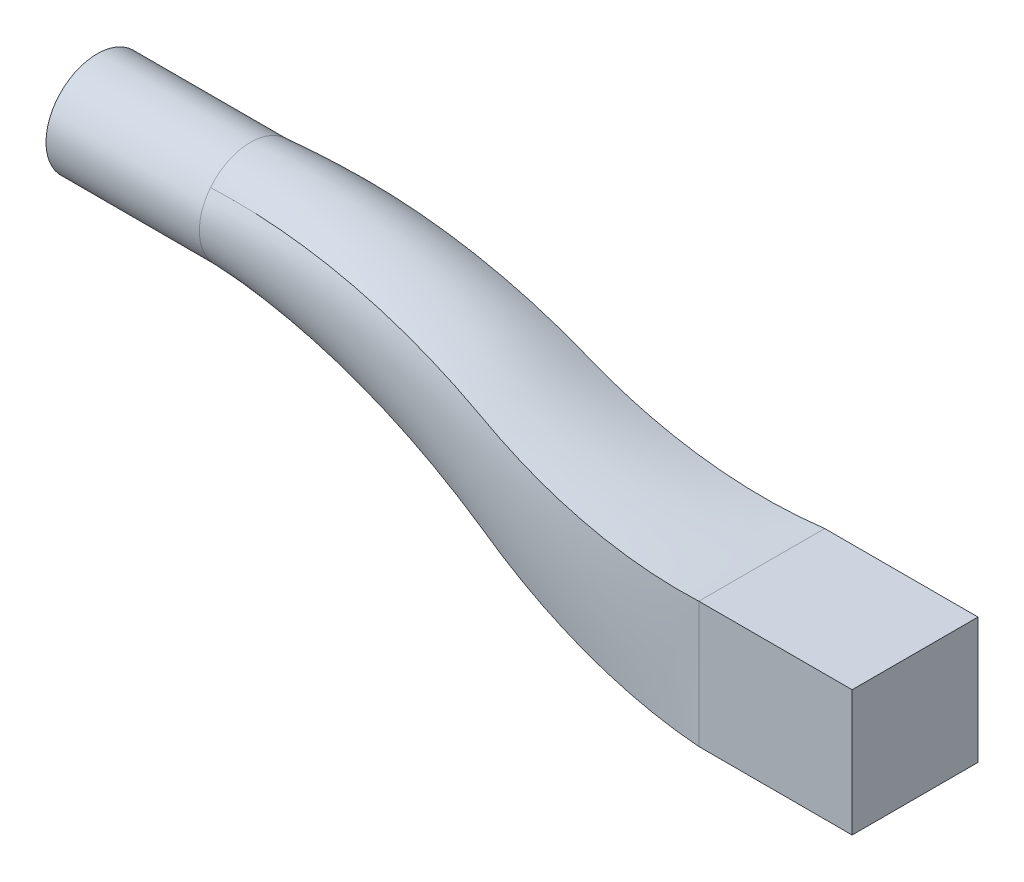
ISO-10303-21;
HEADER;
FILE_DESCRIPTION(('STEP AP214'),'2;1');
FILE_NAME('part.step','',(''),(''),'','','');
FILE_SCHEMA(('AUTOMOTIVE_DESIGN { 1 0 10303 214 1 1 1 1 }'));
ENDSEC;
DATA;
#1=APPLICATION_CONTEXT('core data for automotive mechanical design processes');
#2=APPLICATION_PROTOCOL_DEFINITION('international standard','automotive_design',2000,#1);
#3=PRODUCT_CONTEXT('',#1,'mechanical');
#4=PRODUCT('Part','Part','',(#3));
#5=PRODUCT_RELATED_PRODUCT_CATEGORY('part','',(#4));
#6=PRODUCT_DEFINITION_FORMATION('','',#4);
#7=PRODUCT_DEFINITION_CONTEXT('part definition',#1,'design');
#8=PRODUCT_DEFINITION('design','',#6,#7);
#9=PRODUCT_DEFINITION_SHAPE('','',#8);
#10=(LENGTH_UNIT() NAMED_UNIT(*) SI_UNIT(.MILLI.,.METRE.));
#11=(NAMED_UNIT(*) PLANE_ANGLE_UNIT() SI_UNIT($,.RADIAN.));
#12=(NAMED_UNIT(*) SI_UNIT($,.STERADIAN.) SOLID_ANGLE_UNIT());
#13=UNCERTAINTY_MEASURE_WITH_UNIT(LENGTH_MEASURE(1.E-05),#10,'distance_accuracy_value','');
#14=(GEOMETRIC_REPRESENTATION_CONTEXT(3) GLOBAL_UNCERTAINTY_ASSIGNED_CONTEXT((#13)) GLOBAL_UNIT_ASSIGNED_CONTEXT((#10,
#11,#12)) REPRESENTATION_CONTEXT('',''));
#15=CARTESIAN_POINT('',(0.,0.,0.));
#16=DIRECTION('',(0.,0.,1.));
#17=DIRECTION('',(1.,0.,0.));
#18=AXIS2_PLACEMENT_3D('',#15,#16,#17);
#19=CARTESIAN_POINT('',(1021.37315576226,-118.243305111773,125.73));
#20=CARTESIAN_POINT('',(864.402326566791,-131.656754821237,118.929127854998));
#21=CARTESIAN_POINT('',(708.143629326013,-103.611491656139,112.128255709995));
#22=CARTESIAN_POINT('',(392.936444227267,45.4312189083684,96.7959065081983));
#23=CARTESIAN_POINT('',(196.914895518404,80.6131064873941,88.2644294514036));
#24=CARTESIAN_POINT('',(0.,63.7863619156872,79.7329523946089));
#25=CARTESIAN_POINT('',(1021.37315576226,-118.243305111772,114.726095999935));
#26=CARTESIAN_POINT('',(864.402326566791,-130.815229397028,108.878980639018));
#27=CARTESIAN_POINT('',(708.143629326013,-101.92844080772,103.0318652781));
#28=CARTESIAN_POINT('',(392.936444227267,49.0114619684742,89.8497303069753));
#29=CARTESIAN_POINT('',(196.914895518404,85.2490163349766,82.5147106967684));
#30=CARTESIAN_POINT('',(0.,69.4779385507464,75.1796910865616));
#31=CARTESIAN_POINT('',(1021.37315576226,-118.243305111773,93.2899023629017));
#32=CARTESIAN_POINT('',(864.402326566792,-129.240817430892,89.0552056625087));
#33=CARTESIAN_POINT('',(708.143629326014,-98.7796168754477,84.8205089621158));
#34=CARTESIAN_POINT('',(392.936444227267,55.7097474312092,75.2735204009744));
#35=CARTESIAN_POINT('',(196.914895518404,93.9223513620388,69.961228540226));
#36=CARTESIAN_POINT('',(0.,80.1263231421358,64.6489366794775));
#37=CARTESIAN_POINT('',(1021.37315576226,-118.243305111773,67.2687703282233));
#38=CARTESIAN_POINT('',(864.402326566791,-127.707608205616,64.4779491553693));
#39=CARTESIAN_POINT('',(708.143629326013,-95.7131984248958,61.6871279825154));
#40=CARTESIAN_POINT('',(392.936444227267,62.2327371479365,55.3953107170768));
#41=CARTESIAN_POINT('',(196.914895518404,102.368703119665,51.8943146244922));
#42=CARTESIAN_POINT('',(0.,90.4960369406618,48.3933185319076));
#43=CARTESIAN_POINT('',(1021.37315576226,-118.243305111773,46.624739973406));
#44=CARTESIAN_POINT('',(864.402326566791,-126.823050917887,44.7727425352965));
#45=CARTESIAN_POINT('',(708.143629326013,-93.9440838494382,42.920745097187));
#46=CARTESIAN_POINT('',(392.936444227267,65.996057898027,38.7454759792704));
#47=CARTESIAN_POINT('',(196.914895518404,107.24167275666,36.4222042994632));
#48=CARTESIAN_POINT('',(0.,96.4786554645605,34.098932619656));
#49=CARTESIAN_POINT('',(1021.37315576226,-118.243305111773,31.1622427577089));
#50=CARTESIAN_POINT('',(864.402326566792,-126.342509099629,29.9439661274253));
#51=CARTESIAN_POINT('',(708.143629326013,-92.9830002129212,28.7256894971417));
#52=CARTESIAN_POINT('',(392.936444227267,68.0405077273666,25.9791237153363));
#53=CARTESIAN_POINT('',(196.914895518404,109.888946960564,24.4508345638145));
#54=CARTESIAN_POINT('',(0.,99.7287540430287,22.9225454122928));
#55=CARTESIAN_POINT('',(1021.37315576226,-118.243305111773,15.6543590063811));
#56=CARTESIAN_POINT('',(864.402326566792,-126.054057236597,15.0372779478459));
#57=CARTESIAN_POINT('',(708.143629326013,-92.406096486858,14.4201968893107));
#58=CARTESIAN_POINT('',(392.936444227267,69.2677169727241,13.0290073369195));
#59=CARTESIAN_POINT('',(196.914895518404,111.478009862184,12.2548988430634));
#60=CARTESIAN_POINT('',(0.,101.679670600911,11.4807903492074));
#61=CARTESIAN_POINT('',(1021.37315576226,-118.243305111773,5.23875000000003));
#62=CARTESIAN_POINT('',(864.402326566791,-125.99072679191,5.02783810616596));
#63=CARTESIAN_POINT('',(708.143629326013,-92.2794355974837,4.81692621233189));
#64=CARTESIAN_POINT('',(392.936444227267,69.5371543284614,4.34143207891363));
#65=CARTESIAN_POINT('',(196.914895518404,111.826893239597,4.07684983932944));
#66=CARTESIAN_POINT('',(0.,102.108,3.81226759974524));
#67=CARTESIAN_POINT('',(1021.37315576226,-118.243305111773,-5.23875));
#68=CARTESIAN_POINT('',(864.402326566791,-125.99072679191,-5.02783810616594));
#69=CARTESIAN_POINT('',(708.143629326013,-92.2794355974837,-4.81692621233187));
#70=CARTESIAN_POINT('',(392.936444227267,69.5371543284613,-4.34143207891361));
#71=CARTESIAN_POINT('',(196.914895518404,111.826893239597,-4.07684983932942));
#72=CARTESIAN_POINT('',(0.,102.108,-3.81226759974524));
#73=CARTESIAN_POINT('',(1021.37315576226,-118.243305111772,-15.654359006381));
#74=CARTESIAN_POINT('',(864.402326566791,-126.054057236597,-15.0372779478459));
#75=CARTESIAN_POINT('',(708.143629326013,-92.4060964868579,-14.4201968893107));
#76=CARTESIAN_POINT('',(392.936444227267,69.2677169727242,-13.0290073369195));
#77=CARTESIAN_POINT('',(196.914895518404,111.478009862184,-12.2548988430634));
#78=CARTESIAN_POINT('',(0.,101.679670600912,-11.4807903492074));
#79=CARTESIAN_POINT('',(1021.37315576226,-118.243305111772,-31.1622427577088));
#80=CARTESIAN_POINT('',(864.402326566791,-126.342509099629,-29.9439661274252));
#81=CARTESIAN_POINT('',(708.143629326013,-92.9830002129212,-28.7256894971417));
#82=CARTESIAN_POINT('',(392.936444227267,68.0405077273665,-25.9791237153363));
#83=CARTESIAN_POINT('',(196.914895518404,109.888946960564,-24.4508345638146));
#84=CARTESIAN_POINT('',(0.,99.7287540430284,-22.9225454122928));
#85=CARTESIAN_POINT('',(1021.37315576226,-118.243305111773,-46.6247399734058));
#86=CARTESIAN_POINT('',(864.402326566791,-126.823050917887,-44.7727425352964));
#87=CARTESIAN_POINT('',(708.143629326013,-93.9440838494381,-42.9207450971869));
#88=CARTESIAN_POINT('',(392.936444227267,65.9960578980272,-38.7454759792703));
#89=CARTESIAN_POINT('',(196.914895518404,107.24167275666,-36.4222042994631));
#90=CARTESIAN_POINT('',(0.,96.4786554645609,-34.098932619656));
#91=CARTESIAN_POINT('',(1021.37315576226,-118.243305111773,-67.2687703282232));
#92=CARTESIAN_POINT('',(864.402326566792,-127.707608205616,-64.4779491553692));
#93=CARTESIAN_POINT('',(708.143629326014,-95.713198424896,-61.6871279825153));
#94=CARTESIAN_POINT('',(392.936444227267,62.2327371479361,-55.3953107170768));
#95=CARTESIAN_POINT('',(196.914895518404,102.368703119665,-51.8943146244922));
#96=CARTESIAN_POINT('',(0.,90.4960369406614,-48.3933185319077));
#97=CARTESIAN_POINT('',(1021.37315576226,-118.243305111772,-93.2899023629017));
#98=CARTESIAN_POINT('',(864.402326566791,-129.240817430892,-89.0552056625088));
#99=CARTESIAN_POINT('',(708.143629326013,-98.7796168754475,-84.8205089621158));
#100=CARTESIAN_POINT('',(392.936444227267,55.7097474312094,-75.2735204009744));
#101=CARTESIAN_POINT('',(196.914895518404,93.9223513620389,-69.961228540226));
#102=CARTESIAN_POINT('',(0.,80.1263231421359,-64.6489366794775));
#103=CARTESIAN_POINT('',(1021.37315576226,-118.243305111773,-114.726095999935));
#104=CARTESIAN_POINT('',(864.402326566791,-130.815229397028,-108.878980639018));
#105=CARTESIAN_POINT('',(708.143629326013,-101.92844080772,-103.0318652781));
#106=CARTESIAN_POINT('',(392.936444227267,49.0114619684742,-89.8497303069752));
#107=CARTESIAN_POINT('',(196.914895518404,85.2490163349766,-82.5147106967684));
#108=CARTESIAN_POINT('',(0.,69.4779385507464,-75.1796910865616));
#109=CARTESIAN_POINT('',(1021.37315576226,-118.243305111773,-125.73));
#110=CARTESIAN_POINT('',(864.402326566791,-131.656754821238,-118.929127854998));
#111=CARTESIAN_POINT('',(708.143629326013,-103.611491656139,-112.128255709995));
#112=CARTESIAN_POINT('',(392.936444227267,45.4312189083684,-96.7959065081983));
#113=CARTESIAN_POINT('',(196.914895518404,80.613106487394,-88.2644294514036));
#114=CARTESIAN_POINT('',(0.,63.7863619156871,-79.7329523946089));
#115=B_SPLINE_SURFACE_WITH_KNOTS('',3,3,((#19,#20,#21,#22,#23,#24),(#25,#26,#27,#28,#29,#30),
(#31,#32,#33,#34,#35,#36),(#37,#38,#39,#40,#41,#42),(#43,#44,#45,#46,#47,#48),(#49,#50,#51,#52,
#53,#54),(#55,#56,#57,#58,#59,#60),(#61,#62,#63,#64,#65,#66),(#67,#68,#69,#70,#71,#72),(#73,#74,
#75,#76,#77,#78),(#79,#80,#81,#82,#83,#84),(#85,#86,#87,#88,#89,#90),(#91,#92,#93,#94,#95,#96),
(#97,#98,#99,#100,#101,#102),(#103,#104,#105,#106,#107,#108),(#109,#110,#111,#112,#113,#114)),
.UNSPECIFIED.,.F.,.F.,.F.,(4,1,1,1,1,1,2,1,1,1,1,1,4),(4,2,4),(0.732388356261361,
0.765839811728691,0.799291267196021,0.816016994929686,0.832742722663351,0.849468450397016,
0.866194178130681,0.882919905864346,0.899645633598011,0.916371361331675,0.93309708906534,
0.96654854453267,1.),(0.,0.443563608909016,1.),.UNSPECIFIED.);
#116=DIRECTION('',(0.,0.,-1.));
#117=VECTOR('',#116,1.);
#118=CARTESIAN_POINT('',(1021.37315576226,-118.243305111773,-125.73));
#119=LINE('',#118,#117);
#120=CARTESIAN_POINT('',(1021.37315576226,-118.243305111773,125.73));
#121=VERTEX_POINT('',#120);
#122=CARTESIAN_POINT('',(1021.37315576226,-118.243305111773,-125.73));
#123=VERTEX_POINT('',#122);
#124=EDGE_CURVE('E184',#121,#123,#119,.T.);
#125=CARTESIAN_POINT('',(1021.37315576226,-118.243305111773,-125.73));
#126=CARTESIAN_POINT('',(864.402326566791,-131.656754821238,-118.929127854998));
#127=CARTESIAN_POINT('',(708.143629326013,-103.611491656139,-112.128255709995));
#128=CARTESIAN_POINT('',(392.936444227267,45.4312189083684,-96.7959065081983));
#129=CARTESIAN_POINT('',(196.914895518404,80.613106487394,-88.2644294514036));
#130=CARTESIAN_POINT('',(0.,63.7863619156871,-79.7329523946089));
#131=B_SPLINE_CURVE_WITH_KNOTS('',3,(#125,#126,#127,#128,#129,#130),.UNSPECIFIED.,.F.,.F.,(4,2,
4),(0.,0.443563608909016,1.),.UNSPECIFIED.);
#132=CARTESIAN_POINT('',(0.,63.7867229035302,-79.7334037330846));
#133=VERTEX_POINT('',#132);
#134=EDGE_CURVE('E349',#123,#133,#131,.T.);
#135=CARTESIAN_POINT('',(0.,0.,0.));
#136=DIRECTION('',(-1.,0.,0.));
#137=DIRECTION('',(0.,0.,1.));
#138=AXIS2_PLACEMENT_3D('',#135,#136,#137);
#139=CIRCLE('',#138,102.108);
#140=CARTESIAN_POINT('',(0.,63.7867199932636,79.733400107363));
#141=VERTEX_POINT('',#140);
#142=EDGE_CURVE('E13',#141,#133,#139,.T.);
#143=CARTESIAN_POINT('',(1021.37315576226,-118.243305111773,125.73));
#144=CARTESIAN_POINT('',(864.402326566791,-131.656754821237,118.929127854998));
#145=CARTESIAN_POINT('',(708.143629326013,-103.611491656139,112.128255709995));
#146=CARTESIAN_POINT('',(392.936444227267,45.4312189083684,96.7959065081983));
#147=CARTESIAN_POINT('',(196.914895518404,80.6131064873941,88.2644294514036));
#148=CARTESIAN_POINT('',(0.,63.7863619156872,79.7329523946089));
#149=B_SPLINE_CURVE_WITH_KNOTS('',3,(#143,#144,#145,#146,#147,#148),.UNSPECIFIED.,.F.,.F.,(4,2,
4),(0.,0.443563608909016,1.),.UNSPECIFIED.);
#150=EDGE_CURVE('E351',#121,#141,#149,.T.);
#151=ORIENTED_EDGE('',*,*,#124,.T.);
#152=ORIENTED_EDGE('',*,*,#134,.T.);
#153=ORIENTED_EDGE('',*,*,#142,.F.);
#154=ORIENTED_EDGE('',*,*,#150,.F.);
#155=EDGE_LOOP('',(#151,#152,#153,#154));
#156=FACE_BOUND('',#155,.T.);
#157=ADVANCED_FACE('F115',(#156),#115,.T.);
#158=CARTESIAN_POINT('',(1021.37315576226,-369.703305111773,125.73));
#159=CARTESIAN_POINT('',(864.402326566791,-366.966293375542,116.805196891922));
#160=CARTESIAN_POINT('',(708.143629326013,-322.770568764749,107.880393783845));
#161=CARTESIAN_POINT('',(392.936444227267,-137.31715831118,87.7597100108249));
#162=CARTESIAN_POINT('',(196.914895518404,-81.8750322887881,76.5638293458828));
#163=CARTESIAN_POINT('',(0.,-78.4415384171288,65.3679486809407));
#164=CARTESIAN_POINT('',(1021.37315576226,-359.225805111773,125.73));
#165=CARTESIAN_POINT('',(864.402326566791,-357.413422982725,117.554616448241));
#166=CARTESIAN_POINT('',(708.143629326013,-314.142327979113,109.379232896483));
#167=CARTESIAN_POINT('',(392.936444227267,-130.773465465481,90.9480915955385));
#168=CARTESIAN_POINT('',(196.914895518404,-76.4912577758443,80.6923338463531));
#169=CARTESIAN_POINT('',(0.,-74.2176822369396,70.4365760971678));
#170=CARTESIAN_POINT('',(1021.37315576226,-338.270805111773,125.73));
#171=CARTESIAN_POINT('',(864.402326566791,-338.162007255129,118.932030979872));
#172=CARTESIAN_POINT('',(708.143629326013,-296.594496523922,112.134061959743));
#173=CARTESIAN_POINT('',(392.936444227267,-117.066310382714,96.8082577603214));
#174=CARTESIAN_POINT('',(196.914895518404,-64.9211947930976,88.280422581028));
#175=CARTESIAN_POINT('',(0.,-64.7847113542133,79.7525874017347));
#176=CARTESIAN_POINT('',(1021.37315576226,-306.838305111773,125.73));
#177=CARTESIAN_POINT('',(864.402326566791,-308.925959731489,120.556371698876));
#178=CARTESIAN_POINT('',(708.143629326013,-269.554901476641,115.382743397752));
#179=CARTESIAN_POINT('',(392.936444227267,-94.9785473438404,103.718963508665));
#180=CARTESIAN_POINT('',(196.914895518404,-45.5888112862698,97.228811920702));
#181=CARTESIAN_POINT('',(0.,-48.2077073794319,90.7386603327387));
#182=CARTESIAN_POINT('',(1021.37315576226,-275.405805111773,125.73));
#183=CARTESIAN_POINT('',(864.402326566791,-279.422950935072,121.678170889581));
#184=CARTESIAN_POINT('',(708.143629326013,-241.981383883809,117.626341779162));
#185=CARTESIAN_POINT('',(392.936444227267,-71.7550060899802,108.491622363417));
#186=CARTESIAN_POINT('',(196.914895518404,-24.7857551677988,103.408732058092));
#187=CARTESIAN_POINT('',(0.,-29.82513639635,98.3258417527661));
#188=CARTESIAN_POINT('',(1021.37315576226,-243.973305111772,125.73));
#189=CARTESIAN_POINT('',(864.402326566791,-249.754731278624,122.255356620643));
#190=CARTESIAN_POINT('',(708.143629326013,-214.077444570912,118.780713241287));
#191=CARTESIAN_POINT('',(392.936444227267,-47.8285805048007,110.947240635401));
#192=CARTESIAN_POINT('',(196.914895518404,-3.07256296678536,106.588411408872));
#193=CARTESIAN_POINT('',(0.,-10.3251775795026,102.229582182343));
#194=CARTESIAN_POINT('',(1021.37315576226,-212.540805111772,125.73));
#195=CARTESIAN_POINT('',(864.402326566791,-220.029325633215,122.266343880729));
#196=CARTESIAN_POINT('',(708.143629326013,-186.059133280094,118.802687761457));
#197=CARTESIAN_POINT('',(392.936444227267,-23.6588589546749,110.993985582776));
#198=CARTESIAN_POINT('',(196.914895518404,18.9556631972402,106.648939523367));
#199=CARTESIAN_POINT('',(0.,9.56155319842287,102.303893463957));
#200=CARTESIAN_POINT('',(1021.37315576226,-181.108305111772,125.73));
#201=CARTESIAN_POINT('',(864.402326566791,-190.356893345097,121.710681097036));
#202=CARTESIAN_POINT('',(708.143629326013,-158.146768703858,117.691362194071));
#203=CARTESIAN_POINT('',(392.936444227267,0.285489137496715,108.629936003473));
#204=CARTESIAN_POINT('',(196.914895518404,40.6920625172296,103.587828715839));
#205=CARTESIAN_POINT('',(0.,29.09000374623,98.5457214282048));
#206=CARTESIAN_POINT('',(1021.37315576226,-149.675805111772,125.73));
#207=CARTESIAN_POINT('',(864.402326566791,-160.845542585555,120.609244504902));
#208=CARTESIAN_POINT('',(708.143629326013,-130.556567184774,115.488489009804));
#209=CARTESIAN_POINT('',(392.936444227267,23.5445210072413,103.943909174472));
#210=CARTESIAN_POINT('',(196.914895518404,61.5410739780931,97.5200848342387));
#211=CARTESIAN_POINT('',(0.,47.5289947982123,91.096260494005));
#212=CARTESIAN_POINT('',(1021.37315576226,-128.720805111773,125.73));
#213=CARTESIAN_POINT('',(864.402326566791,-141.346866463103,119.538533891782));
#214=CARTESIAN_POINT('',(708.143629326013,-112.51421493987,113.347067783564));
#215=CARTESIAN_POINT('',(392.936444227267,38.3036375486349,99.3886050425687));
#216=CARTESIAN_POINT('',(196.914895518404,74.4732786935242,91.6216084097912));
#217=CARTESIAN_POINT('',(0.,58.6342876876811,83.8546117770138));
#218=CARTESIAN_POINT('',(1021.37315576226,-118.243305111773,125.73));
#219=CARTESIAN_POINT('',(864.402326566791,-131.656754821237,118.929127854998));
#220=CARTESIAN_POINT('',(708.143629326013,-103.611491656139,112.128255709995));
#221=CARTESIAN_POINT('',(392.936444227267,45.4312189083684,96.7959065081983));
#222=CARTESIAN_POINT('',(196.914895518404,80.6131064873941,88.2644294514036));
#223=CARTESIAN_POINT('',(0.,63.7863619156872,79.7329523946089));
#224=B_SPLINE_SURFACE_WITH_KNOTS('',3,3,((#158,#159,#160,#161,#162,#163),(#164,#165,#166,#167,
#168,#169),(#170,#171,#172,#173,#174,#175),(#176,#177,#178,#179,#180,#181),(#182,#183,#184,#185,
#186,#187),(#188,#189,#190,#191,#192,#193),(#194,#195,#196,#197,#198,#199),(#200,#201,#202,#203,
#204,#205),(#206,#207,#208,#209,#210,#211),(#212,#213,#214,#215,#216,#217),(#218,#219,#220,#221,
#222,#223)),.UNSPECIFIED.,.F.,.F.,.F.,(4,1,1,1,1,1,1,1,4),(4,2,4),(0.483979693536605,
0.515030776377199,0.546081859217794,0.577132942058388,0.608184024898983,0.639235107739578,
0.670286190580172,0.701337273420767,0.732388356261361),(0.,0.443563608909016,1.),.UNSPECIFIED.);
#225=DIRECTION('',(0.,1.,0.));
#226=VECTOR('',#225,1.);
#227=CARTESIAN_POINT('',(1021.37315576226,-118.243305111773,125.73));
#228=LINE('',#227,#226);
#229=CARTESIAN_POINT('',(1021.37315576226,-369.703305111773,125.73));
#230=VERTEX_POINT('',#229);
#231=EDGE_CURVE('E212',#230,#121,#228,.T.);
#232=CARTESIAN_POINT('',(0.,-78.441991025334,65.3683259044379));
#233=VERTEX_POINT('',#232);
#234=EDGE_CURVE('E144',#233,#141,#139,.T.);
#235=CARTESIAN_POINT('',(1021.37315576226,-369.703305111773,125.73));
#236=CARTESIAN_POINT('',(864.402326566791,-366.966293375542,116.805196891922));
#237=CARTESIAN_POINT('',(708.143629326013,-322.770568764749,107.880393783845));
#238=CARTESIAN_POINT('',(392.936444227267,-137.31715831118,87.7597100108249));
#239=CARTESIAN_POINT('',(196.914895518404,-81.8750322887881,76.5638293458828));
#240=CARTESIAN_POINT('',(0.,-78.4415384171288,65.3679486809407));
#241=B_SPLINE_CURVE_WITH_KNOTS('',3,(#235,#236,#237,#238,#239,#240),.UNSPECIFIED.,.F.,.F.,(4,2,
4),(0.,0.443563608909016,1.),.UNSPECIFIED.);
#242=EDGE_CURVE('E367',#230,#233,#241,.T.);
#243=ORIENTED_EDGE('',*,*,#231,.T.);
#244=ORIENTED_EDGE('',*,*,#150,.T.);
#245=ORIENTED_EDGE('',*,*,#234,.F.);
#246=ORIENTED_EDGE('',*,*,#242,.F.);
#247=EDGE_LOOP('',(#243,#244,#245,#246));
#248=FACE_BOUND('',#247,.T.);
#249=ADVANCED_FACE('F399',(#248),#224,.T.);
#250=CARTESIAN_POINT('',(1021.37315576226,-369.703305111773,-125.73));
#251=CARTESIAN_POINT('',(864.402326566791,-366.966293375542,-116.805196891922));
#252=CARTESIAN_POINT('',(708.143629326013,-322.770568764749,-107.880393783845));
#253=CARTESIAN_POINT('',(392.936444227267,-137.31715831118,-87.7597100108248));
#254=CARTESIAN_POINT('',(196.914895518404,-81.8750322887881,-76.5638293458828));
#255=CARTESIAN_POINT('',(0.,-78.4415384171288,-65.3679486809408));
#256=CARTESIAN_POINT('',(1021.37315576226,-369.703305111773,-115.2525));
#257=CARTESIAN_POINT('',(864.402326566791,-367.52584413233,-107.205381887892));
#258=CARTESIAN_POINT('',(708.143629326013,-323.889670278324,-99.1582637757841));
#259=CARTESIAN_POINT('',(392.936444227267,-139.69774914793,-81.0162928149548));
#260=CARTESIAN_POINT('',(196.914895518404,-84.9575616919247,-70.9214399662336));
#261=CARTESIAN_POINT('',(0.,-82.2260063866525,-60.8265871175123));
#262=CARTESIAN_POINT('',(1021.37315576226,-369.703305111772,-94.2975));
#263=CARTESIAN_POINT('',(864.402326566791,-368.528048208667,-87.9083538848774));
#264=CARTESIAN_POINT('',(708.143629326013,-325.894078430998,-81.5192077697547));
#265=CARTESIAN_POINT('',(392.936444227267,-143.96159440547,-67.1150817621291));
#266=CARTESIAN_POINT('',(196.914895518404,-90.4786399779944,-59.1001018696261));
#267=CARTESIAN_POINT('',(0.,-89.0043177012509,-51.085121977123));
#268=CARTESIAN_POINT('',(1021.37315576226,-369.703305111773,-62.865));
#269=CARTESIAN_POINT('',(864.402326566792,-369.635321895222,-58.735475523149));
#270=CARTESIAN_POINT('',(708.143629326013,-328.108625804108,-54.605951046298));
#271=CARTESIAN_POINT('',(392.936444227267,-148.672454966397,-45.2960699065716));
#272=CARTESIAN_POINT('',(196.914895518404,-96.578540040182,-40.1157132436962));
#273=CARTESIAN_POINT('',(0.,-96.4932572646999,-34.9353565808208));
#274=CARTESIAN_POINT('',(1021.37315576226,-369.703305111773,-31.4325));
#275=CARTESIAN_POINT('',(864.402326566791,-370.313319197354,-29.4071935651787));
#276=CARTESIAN_POINT('',(708.143629326013,-329.464620408372,-27.3818871303575));
#277=CARTESIAN_POINT('',(392.936444227267,-151.556972850104,-22.8158984104923));
#278=CARTESIAN_POINT('',(196.914895518404,-100.313583901201,-20.2752161254483));
#279=CARTESIAN_POINT('',(0.,-101.078827103032,-17.7345338404044));
#280=CARTESIAN_POINT('',(1021.37315576226,-369.703305111773,0.));
#281=CARTESIAN_POINT('',(864.402326566791,-370.541598695606,0.));
#282=CARTESIAN_POINT('',(708.143629326013,-329.921179404876,0.));
#283=CARTESIAN_POINT('',(392.936444227267,-152.528180689901,0.));
#284=CARTESIAN_POINT('',(196.914895518404,-101.571161086039,0.));
#285=CARTESIAN_POINT('',(0.,-102.622773632911,0.));
#286=CARTESIAN_POINT('',(1021.37315576226,-369.703305111773,31.4325000000001));
#287=CARTESIAN_POINT('',(864.402326566791,-370.313319197354,29.4071935651788));
#288=CARTESIAN_POINT('',(708.143629326013,-329.464620408372,27.3818871303575));
#289=CARTESIAN_POINT('',(392.936444227267,-151.556972850104,22.8158984104922));
#290=CARTESIAN_POINT('',(196.914895518404,-100.313583901202,20.2752161254482));
#291=CARTESIAN_POINT('',(0.,-101.078827103032,17.7345338404043));
#292=CARTESIAN_POINT('',(1021.37315576226,-369.703305111772,62.8650000000001));
#293=CARTESIAN_POINT('',(864.402326566791,-369.635321895222,58.735475523149));
#294=CARTESIAN_POINT('',(708.143629326013,-328.108625804108,54.605951046298));
#295=CARTESIAN_POINT('',(392.936444227267,-148.672454966396,45.2960699065716));
#296=CARTESIAN_POINT('',(196.914895518404,-96.5785400401816,40.1157132436962));
#297=CARTESIAN_POINT('',(0.,-96.4932572646994,34.9353565808209));
#298=CARTESIAN_POINT('',(1021.37315576226,-369.703305111772,94.2975000000001));
#299=CARTESIAN_POINT('',(864.402326566791,-368.528048208667,87.9083538848774));
#300=CARTESIAN_POINT('',(708.143629326013,-325.894078430998,81.5192077697547));
#301=CARTESIAN_POINT('',(392.936444227267,-143.961594405471,67.115081762129));
#302=CARTESIAN_POINT('',(196.914895518404,-90.4786399779947,59.100101869626));
#303=CARTESIAN_POINT('',(0.,-89.0043177012514,51.0851219771229));
#304=CARTESIAN_POINT('',(1021.37315576226,-369.703305111773,115.2525));
#305=CARTESIAN_POINT('',(864.402326566791,-367.52584413233,107.205381887892));
#306=CARTESIAN_POINT('',(708.143629326013,-323.889670278324,99.1582637757841));
#307=CARTESIAN_POINT('',(392.936444227267,-139.69774914793,81.0162928149549));
#308=CARTESIAN_POINT('',(196.914895518404,-84.9575616919247,70.9214399662336));
#309=CARTESIAN_POINT('',(0.,-82.2260063866525,60.8265871175123));
#310=CARTESIAN_POINT('',(1021.37315576226,-369.703305111773,125.73));
#311=CARTESIAN_POINT('',(864.402326566791,-366.966293375542,116.805196891922));
#312=CARTESIAN_POINT('',(708.143629326013,-322.770568764749,107.880393783845));
#313=CARTESIAN_POINT('',(392.936444227267,-137.31715831118,87.7597100108249));
#314=CARTESIAN_POINT('',(196.914895518404,-81.8750322887881,76.5638293458828));
#315=CARTESIAN_POINT('',(0.,-78.4415384171288,65.3679486809407));
#316=B_SPLINE_SURFACE_WITH_KNOTS('',3,3,((#250,#251,#252,#253,#254,#255),(#256,#257,#258,#259,
#260,#261),(#262,#263,#264,#265,#266,#267),(#268,#269,#270,#271,#272,#273),(#274,#275,#276,#277,
#278,#279),(#280,#281,#282,#283,#284,#285),(#286,#287,#288,#289,#290,#291),(#292,#293,#294,#295,
#296,#297),(#298,#299,#300,#301,#302,#303),(#304,#305,#306,#307,#308,#309),(#310,#311,#312,#313,
#314,#315)),.UNSPECIFIED.,.F.,.F.,.F.,(4,1,1,1,1,1,1,1,4),(4,2,4),(0.248408662724757,
0.277855041576238,0.307301420427719,0.3367477992792,0.366194178130681,0.395640556982162,
0.425086935833643,0.454533314685124,0.483979693536605),(0.,0.443563608909016,1.),.UNSPECIFIED.);
#317=DIRECTION('',(0.,0.,1.));
#318=VECTOR('',#317,1.);
#319=CARTESIAN_POINT('',(1021.37315576226,-369.703305111773,125.73));
#320=LINE('',#319,#318);
#321=CARTESIAN_POINT('',(1021.37315576226,-369.703305111773,-125.73));
#322=VERTEX_POINT('',#321);
#323=EDGE_CURVE('E326',#322,#230,#320,.T.);
#324=CARTESIAN_POINT('',(0.,-78.4419888469789,-65.3683241000228));
#325=VERTEX_POINT('',#324);
#326=EDGE_CURVE('E135',#325,#233,#139,.T.);
#327=CARTESIAN_POINT('',(1021.37315576226,-369.703305111773,-125.73));
#328=CARTESIAN_POINT('',(864.402326566791,-366.966293375542,-116.805196891922));
#329=CARTESIAN_POINT('',(708.143629326013,-322.770568764749,-107.880393783845));
#330=CARTESIAN_POINT('',(392.936444227267,-137.31715831118,-87.7597100108248));
#331=CARTESIAN_POINT('',(196.914895518404,-81.8750322887881,-76.5638293458828));
#332=CARTESIAN_POINT('',(0.,-78.4415384171288,-65.3679486809408));
#333=B_SPLINE_CURVE_WITH_KNOTS('',3,(#327,#328,#329,#330,#331,#332),.UNSPECIFIED.,.F.,.F.,(4,2,
4),(0.,0.443563608909016,1.),.UNSPECIFIED.);
#334=EDGE_CURVE('E355',#322,#325,#333,.T.);
#335=ORIENTED_EDGE('',*,*,#323,.T.);
#336=ORIENTED_EDGE('',*,*,#242,.T.);
#337=ORIENTED_EDGE('',*,*,#326,.F.);
#338=ORIENTED_EDGE('',*,*,#334,.F.);
#339=EDGE_LOOP('',(#335,#336,#337,#338));
#340=FACE_BOUND('',#339,.T.);
#341=ADVANCED_FACE('F242',(#340),#316,.T.);
#342=CARTESIAN_POINT('',(1021.37315576226,-118.243305111773,-125.73));
#343=CARTESIAN_POINT('',(864.402326566791,-131.656754821238,-118.929127854998));
#344=CARTESIAN_POINT('',(708.143629326013,-103.611491656139,-112.128255709995));
#345=CARTESIAN_POINT('',(392.936444227267,45.4312189083684,-96.7959065081983));
#346=CARTESIAN_POINT('',(196.914895518404,80.613106487394,-88.2644294514036));
#347=CARTESIAN_POINT('',(0.,63.7863619156871,-79.7329523946089));
#348=CARTESIAN_POINT('',(1021.37315576226,-128.720805111773,-125.73));
#349=CARTESIAN_POINT('',(864.402326566791,-141.346866463103,-119.538533891782));
#350=CARTESIAN_POINT('',(708.143629326013,-112.514214939871,-113.347067783564));
#351=CARTESIAN_POINT('',(392.936444227267,38.3036375486348,-99.3886050425687));
#352=CARTESIAN_POINT('',(196.914895518404,74.4732786935242,-91.6216084097913));
#353=CARTESIAN_POINT('',(0.,58.634287687681,-83.8546117770138));
#354=CARTESIAN_POINT('',(1021.37315576226,-149.675805111773,-125.73));
#355=CARTESIAN_POINT('',(864.402326566791,-160.845542585555,-120.609244504902));
#356=CARTESIAN_POINT('',(708.143629326013,-130.556567184774,-115.488489009804));
#357=CARTESIAN_POINT('',(392.936444227267,23.5445210072413,-103.943909174472));
#358=CARTESIAN_POINT('',(196.914895518404,61.5410739780931,-97.5200848342386));
#359=CARTESIAN_POINT('',(0.,47.5289947982123,-91.0962604940048));
#360=CARTESIAN_POINT('',(1021.37315576226,-181.108305111773,-125.73));
#361=CARTESIAN_POINT('',(864.402326566791,-190.356893345097,-121.710681097036));
#362=CARTESIAN_POINT('',(708.143629326013,-158.146768703858,-117.691362194071));
#363=CARTESIAN_POINT('',(392.936444227267,0.285489137496771,-108.629936003473));
#364=CARTESIAN_POINT('',(196.914895518404,40.6920625172297,-103.587828715839));
#365=CARTESIAN_POINT('',(0.,29.0900037462301,-98.5457214282051));
#366=CARTESIAN_POINT('',(1021.37315576226,-212.540805111773,-125.73));
#367=CARTESIAN_POINT('',(864.402326566792,-220.029325633215,-122.266343880728));
#368=CARTESIAN_POINT('',(708.143629326013,-186.059133280094,-118.802687761457));
#369=CARTESIAN_POINT('',(392.936444227267,-23.658858954675,-110.993985582776));
#370=CARTESIAN_POINT('',(196.914895518404,18.9556631972402,-106.648939523366));
#371=CARTESIAN_POINT('',(0.,9.56155319842291,-102.303893463956));
#372=CARTESIAN_POINT('',(1021.37315576226,-243.973305111773,-125.73));
#373=CARTESIAN_POINT('',(864.402326566792,-249.754731278624,-122.255356620644));
#374=CARTESIAN_POINT('',(708.143629326014,-214.077444570912,-118.780713241287));
#375=CARTESIAN_POINT('',(392.936444227267,-47.8285805048008,-110.947240635402));
#376=CARTESIAN_POINT('',(196.914895518404,-3.07256296678529,-106.588411408873));
#377=CARTESIAN_POINT('',(0.,-10.3251775795024,-102.229582182344));
#378=CARTESIAN_POINT('',(1021.37315576226,-275.405805111773,-125.73));
#379=CARTESIAN_POINT('',(864.402326566791,-279.422950935072,-121.678170889581));
#380=CARTESIAN_POINT('',(708.143629326013,-241.981383883809,-117.626341779162));
#381=CARTESIAN_POINT('',(392.936444227267,-71.7550060899802,-108.491622363417));
#382=CARTESIAN_POINT('',(196.914895518404,-24.7857551677988,-103.408732058092));
#383=CARTESIAN_POINT('',(0.,-29.82513639635,-98.3258417527659));
#384=CARTESIAN_POINT('',(1021.37315576226,-306.838305111773,-125.73));
#385=CARTESIAN_POINT('',(864.402326566791,-308.925959731489,-120.556371698876));
#386=CARTESIAN_POINT('',(708.143629326013,-269.554901476641,-115.382743397752));
#387=CARTESIAN_POINT('',(392.936444227267,-94.9785473438403,-103.718963508665));
#388=CARTESIAN_POINT('',(196.914895518404,-45.5888112862699,-97.2288119207021));
#389=CARTESIAN_POINT('',(0.,-48.2077073794319,-90.7386603327389));
#390=CARTESIAN_POINT('',(1021.37315576226,-338.270805111773,-125.73));
#391=CARTESIAN_POINT('',(864.402326566791,-338.162007255129,-118.932030979872));
#392=CARTESIAN_POINT('',(708.143629326013,-296.594496523922,-112.134061959743));
#393=CARTESIAN_POINT('',(392.936444227267,-117.066310382714,-96.8082577603213));
#394=CARTESIAN_POINT('',(196.914895518404,-64.9211947930976,-88.280422581028));
#395=CARTESIAN_POINT('',(0.,-64.7847113542132,-79.7525874017347));
#396=CARTESIAN_POINT('',(1021.37315576226,-359.225805111773,-125.73));
#397=CARTESIAN_POINT('',(864.402326566791,-357.413422982725,-117.554616448241));
#398=CARTESIAN_POINT('',(708.143629326013,-314.142327979113,-109.379232896482));
#399=CARTESIAN_POINT('',(392.936444227267,-130.773465465481,-90.9480915955384));
#400=CARTESIAN_POINT('',(196.914895518404,-76.4912577758442,-80.6923338463531));
#401=CARTESIAN_POINT('',(0.,-74.2176822369396,-70.4365760971678));
#402=CARTESIAN_POINT('',(1021.37315576226,-369.703305111773,-125.73));
#403=CARTESIAN_POINT('',(864.402326566791,-366.966293375542,-116.805196891922));
#404=CARTESIAN_POINT('',(708.143629326013,-322.770568764749,-107.880393783845));
#405=CARTESIAN_POINT('',(392.936444227267,-137.31715831118,-87.7597100108248));
#406=CARTESIAN_POINT('',(196.914895518404,-81.8750322887881,-76.5638293458828));
#407=CARTESIAN_POINT('',(0.,-78.4415384171288,-65.3679486809408));
#408=B_SPLINE_SURFACE_WITH_KNOTS('',3,3,((#342,#343,#344,#345,#346,#347),(#348,#349,#350,#351,
#352,#353),(#354,#355,#356,#357,#358,#359),(#360,#361,#362,#363,#364,#365),(#366,#367,#368,#369,
#370,#371),(#372,#373,#374,#375,#376,#377),(#378,#379,#380,#381,#382,#383),(#384,#385,#386,#387,
#388,#389),(#390,#391,#392,#393,#394,#395),(#396,#397,#398,#399,#400,#401),(#402,#403,#404,#405,
#406,#407)),.UNSPECIFIED.,.F.,.F.,.F.,(4,1,1,1,1,1,1,1,4),(4,2,4),(0.,0.0310510828405946,
0.0621021656811892,0.0931532485217837,0.124204331362378,0.155255414202973,0.186306497043567,
0.217357579884162,0.248408662724757),(0.,0.443563608909016,1.),.UNSPECIFIED.);
#409=DIRECTION('',(0.,-1.,0.));
#410=VECTOR('',#409,1.);
#411=CARTESIAN_POINT('',(1021.37315576226,-369.703305111773,-125.73));
#412=LINE('',#411,#410);
#413=EDGE_CURVE('E121',#123,#322,#412,.T.);
#414=EDGE_CURVE('E127',#133,#325,#139,.T.);
#415=ORIENTED_EDGE('',*,*,#413,.T.);
#416=ORIENTED_EDGE('',*,*,#334,.T.);
#417=ORIENTED_EDGE('',*,*,#414,.F.);
#418=ORIENTED_EDGE('',*,*,#134,.F.);
#419=EDGE_LOOP('',(#415,#416,#417,#418));
#420=FACE_BOUND('',#419,.T.);
#421=ADVANCED_FACE('F234',(#420),#408,.T.);
#422=CARTESIAN_POINT('',(-306.324,0.,0.));
#423=DIRECTION('',(1.,0.,0.));
#424=DIRECTION('',(0.,0.,-1.));
#425=AXIS2_PLACEMENT_3D('',#422,#423,#424);
#426=CYLINDRICAL_SURFACE('',#425,102.108);
#427=CARTESIAN_POINT('',(-306.324,0.,0.));
#428=DIRECTION('',(-1.,0.,0.));
#429=DIRECTION('',(0.,0.,1.));
#430=AXIS2_PLACEMENT_3D('',#427,#428,#429);
#431=CIRCLE('',#430,102.108);
#432=CARTESIAN_POINT('',(-306.324,0.,102.108));
#433=VERTEX_POINT('',#432);
#434=EDGE_CURVE('E209',#433,#433,#431,.T.);
#435=ORIENTED_EDGE('',*,*,#434,.F.);
#436=EDGE_LOOP('',(#435));
#437=FACE_BOUND('',#436,.T.);
#438=ORIENTED_EDGE('',*,*,#142,.T.);
#439=ORIENTED_EDGE('',*,*,#414,.T.);
#440=ORIENTED_EDGE('',*,*,#326,.T.);
#441=ORIENTED_EDGE('',*,*,#234,.T.);
#442=EDGE_LOOP('',(#438,#439,#440,#441));
#443=FACE_BOUND('',#442,.T.);
#444=ADVANCED_FACE('F223',(#437,#443),#426,.T.);
#445=CARTESIAN_POINT('',(-306.324,0.,0.));
#446=DIRECTION('',(-1.,0.,0.));
#447=DIRECTION('',(0.,0.,1.));
#448=AXIS2_PLACEMENT_3D('',#445,#446,#447);
#449=PLANE('',#448);
#450=ORIENTED_EDGE('',*,*,#434,.T.);
#451=EDGE_LOOP('',(#450));
#452=FACE_BOUND('',#451,.T.);
#453=ADVANCED_FACE('F233',(#452),#449,.T.);
#454=CARTESIAN_POINT('',(1327.69715576226,-118.243305111773,125.73));
#455=DIRECTION('',(0.,0.,1.));
#456=DIRECTION('',(0.,-1.,0.));
#457=AXIS2_PLACEMENT_3D('',#454,#455,#456);
#458=PLANE('',#457);
#459=ORIENTED_EDGE('',*,*,#231,.F.);
#460=DIRECTION('',(-1.,0.,0.));
#461=VECTOR('',#460,1.);
#462=CARTESIAN_POINT('',(1327.69715576226,-369.703305111773,125.73));
#463=LINE('',#462,#461);
#464=CARTESIAN_POINT('',(1327.69715576226,-369.703305111773,125.73));
#465=VERTEX_POINT('',#464);
#466=EDGE_CURVE('E204',#465,#230,#463,.T.);
#467=ORIENTED_EDGE('',*,*,#466,.F.);
#468=DIRECTION('',(0.,1.,0.));
#469=VECTOR('',#468,1.);
#470=CARTESIAN_POINT('',(1327.69715576226,-118.243305111773,125.73));
#471=LINE('',#470,#469);
#472=CARTESIAN_POINT('',(1327.69715576226,-118.243305111773,125.73));
#473=VERTEX_POINT('',#472);
#474=EDGE_CURVE('E198',#465,#473,#471,.T.);
#475=ORIENTED_EDGE('',*,*,#474,.T.);
#476=DIRECTION('',(-1.,0.,0.));
#477=VECTOR('',#476,1.);
#478=CARTESIAN_POINT('',(1327.69715576226,-118.243305111773,125.73));
#479=LINE('',#478,#477);
#480=EDGE_CURVE('E178',#473,#121,#479,.T.);
#481=ORIENTED_EDGE('',*,*,#480,.T.);
#482=EDGE_LOOP('',(#459,#467,#475,#481));
#483=FACE_BOUND('',#482,.T.);
#484=ADVANCED_FACE('F203',(#483),#458,.T.);
#485=CARTESIAN_POINT('',(1327.69715576226,-369.703305111773,125.73));
#486=DIRECTION('',(0.,-1.,0.));
#487=DIRECTION('',(0.,0.,-1.));
#488=AXIS2_PLACEMENT_3D('',#485,#486,#487);
#489=PLANE('',#488);
#490=ORIENTED_EDGE('',*,*,#323,.F.);
#491=DIRECTION('',(-1.,0.,0.));
#492=VECTOR('',#491,1.);
#493=CARTESIAN_POINT('',(1327.69715576226,-369.703305111773,-125.73));
#494=LINE('',#493,#492);
#495=CARTESIAN_POINT('',(1327.69715576226,-369.703305111773,-125.73));
#496=VERTEX_POINT('',#495);
#497=EDGE_CURVE('E289',#496,#322,#494,.T.);
#498=ORIENTED_EDGE('',*,*,#497,.F.);
#499=DIRECTION('',(0.,0.,1.));
#500=VECTOR('',#499,1.);
#501=CARTESIAN_POINT('',(1327.69715576226,-369.703305111773,125.73));
#502=LINE('',#501,#500);
#503=EDGE_CURVE('E191',#496,#465,#502,.T.);
#504=ORIENTED_EDGE('',*,*,#503,.T.);
#505=ORIENTED_EDGE('',*,*,#466,.T.);
#506=EDGE_LOOP('',(#490,#498,#504,#505));
#507=FACE_BOUND('',#506,.T.);
#508=ADVANCED_FACE('F309',(#507),#489,.T.);
#509=CARTESIAN_POINT('',(1327.69715576226,-369.703305111773,-125.73));
#510=DIRECTION('',(0.,0.,-1.));
#511=DIRECTION('',(-1.,0.,0.));
#512=AXIS2_PLACEMENT_3D('',#509,#510,#511);
#513=PLANE('',#512);
#514=ORIENTED_EDGE('',*,*,#413,.F.);
#515=DIRECTION('',(-1.,0.,0.));
#516=VECTOR('',#515,1.);
#517=CARTESIAN_POINT('',(1327.69715576226,-118.243305111773,-125.73));
#518=LINE('',#517,#516);
#519=CARTESIAN_POINT('',(1327.69715576226,-118.243305111773,-125.73));
#520=VERTEX_POINT('',#519);
#521=EDGE_CURVE('E190',#520,#123,#518,.T.);
#522=ORIENTED_EDGE('',*,*,#521,.F.);
#523=DIRECTION('',(0.,-1.,0.));
#524=VECTOR('',#523,1.);
#525=CARTESIAN_POINT('',(1327.69715576226,-369.703305111773,-125.73));
#526=LINE('',#525,#524);
#527=EDGE_CURVE('E201',#520,#496,#526,.T.);
#528=ORIENTED_EDGE('',*,*,#527,.T.);
#529=ORIENTED_EDGE('',*,*,#497,.T.);
#530=EDGE_LOOP('',(#514,#522,#528,#529));
#531=FACE_BOUND('',#530,.T.);
#532=ADVANCED_FACE('F304',(#531),#513,.T.);
#533=CARTESIAN_POINT('',(1327.69715576226,-118.243305111773,-125.73));
#534=DIRECTION('',(0.,1.,0.));
#535=DIRECTION('',(0.,0.,1.));
#536=AXIS2_PLACEMENT_3D('',#533,#534,#535);
#537=PLANE('',#536);
#538=ORIENTED_EDGE('',*,*,#124,.F.);
#539=ORIENTED_EDGE('',*,*,#480,.F.);
#540=DIRECTION('',(0.,0.,-1.));
#541=VECTOR('',#540,1.);
#542=CARTESIAN_POINT('',(1327.69715576226,-118.243305111773,-125.73));
#543=LINE('',#542,#541);
#544=EDGE_CURVE('E182',#473,#520,#543,.T.);
#545=ORIENTED_EDGE('',*,*,#544,.T.);
#546=ORIENTED_EDGE('',*,*,#521,.T.);
#547=EDGE_LOOP('',(#538,#539,#545,#546));
#548=FACE_BOUND('',#547,.T.);
#549=ADVANCED_FACE('F180',(#548),#537,.T.);
#550=CARTESIAN_POINT('',(1327.69715576226,0.,0.));
#551=DIRECTION('',(1.,0.,0.));
#552=DIRECTION('',(0.,0.,-1.));
#553=AXIS2_PLACEMENT_3D('',#550,#551,#552);
#554=PLANE('',#553);
#555=ORIENTED_EDGE('',*,*,#474,.F.);
#556=ORIENTED_EDGE('',*,*,#503,.F.);
#557=ORIENTED_EDGE('',*,*,#527,.F.);
#558=ORIENTED_EDGE('',*,*,#544,.F.);
#559=EDGE_LOOP('',(#555,#556,#557,#558));
#560=FACE_BOUND('',#559,.T.);
#561=ADVANCED_FACE('F196',(#560),#554,.T.);
#562=CLOSED_SHELL('',(#157,#249,#341,#421,#444,#453,#484,#508,#532,#549,#561));
#563=MANIFOLD_SOLID_BREP('B2',#562);
#564=ADVANCED_BREP_SHAPE_REPRESENTATION('',(#18,#563),#14);
#565=SHAPE_DEFINITION_REPRESENTATION(#9,#564);
ENDSEC;
END-ISO-10303-21;
